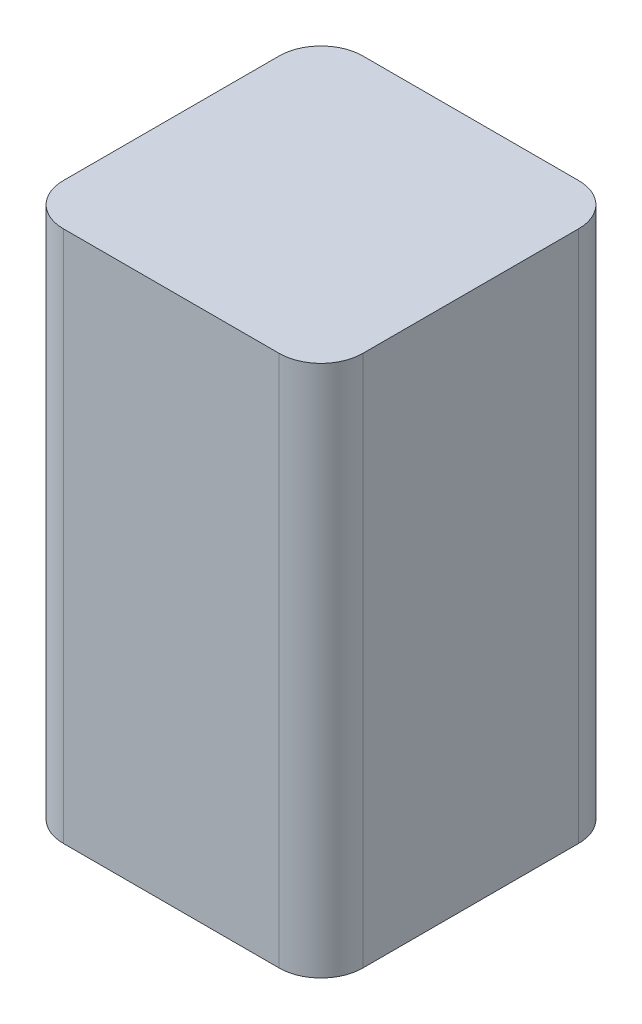
ISO-10303-21;
HEADER;
FILE_DESCRIPTION(('STEP AP214'),'2;1');
FILE_NAME('part.step','',(''),(''),'','','');
FILE_SCHEMA(('AUTOMOTIVE_DESIGN { 1 0 10303 214 1 1 1 1 }'));
ENDSEC;
DATA;
#1=APPLICATION_CONTEXT('core data for automotive mechanical design processes');
#2=APPLICATION_PROTOCOL_DEFINITION('international standard','automotive_design',2000,#1);
#3=PRODUCT_CONTEXT('',#1,'mechanical');
#4=PRODUCT('Part','Part','',(#3));
#5=PRODUCT_RELATED_PRODUCT_CATEGORY('part','',(#4));
#6=PRODUCT_DEFINITION_FORMATION('','',#4);
#7=PRODUCT_DEFINITION_CONTEXT('part definition',#1,'design');
#8=PRODUCT_DEFINITION('design','',#6,#7);
#9=PRODUCT_DEFINITION_SHAPE('','',#8);
#10=(LENGTH_UNIT() NAMED_UNIT(*) SI_UNIT(.MILLI.,.METRE.));
#11=(NAMED_UNIT(*) PLANE_ANGLE_UNIT() SI_UNIT($,.RADIAN.));
#12=(NAMED_UNIT(*) SI_UNIT($,.STERADIAN.) SOLID_ANGLE_UNIT());
#13=UNCERTAINTY_MEASURE_WITH_UNIT(LENGTH_MEASURE(1.E-05),#10,'distance_accuracy_value','');
#14=(GEOMETRIC_REPRESENTATION_CONTEXT(3) GLOBAL_UNCERTAINTY_ASSIGNED_CONTEXT((#13)) GLOBAL_UNIT_ASSIGNED_CONTEXT((#10,
#11,#12)) REPRESENTATION_CONTEXT('',''));
#15=CARTESIAN_POINT('',(0.,0.,0.));
#16=DIRECTION('',(0.,0.,1.));
#17=DIRECTION('',(1.,0.,0.));
#18=AXIS2_PLACEMENT_3D('',#15,#16,#17);
#19=CARTESIAN_POINT('',(5.,8.89,-5.));
#20=DIRECTION('',(0.,0.,1.));
#21=DIRECTION('',(1.,0.,0.));
#22=AXIS2_PLACEMENT_3D('',#19,#20,#21);
#23=PLANE('',#22);
#24=DIRECTION('',(-1.,0.,0.));
#25=VECTOR('',#24,1.);
#26=CARTESIAN_POINT('',(5.,-8.89,-5.));
#27=LINE('',#26,#25);
#28=CARTESIAN_POINT('',(3.603,-8.89,-5.));
#29=VERTEX_POINT('',#28);
#30=CARTESIAN_POINT('',(-3.603,-8.89,-5.));
#31=VERTEX_POINT('',#30);
#32=EDGE_CURVE('E130',#29,#31,#27,.T.);
#33=ORIENTED_EDGE('',*,*,#32,.T.);
#34=DIRECTION('',(0.,-1.,0.));
#35=VECTOR('',#34,1.);
#36=CARTESIAN_POINT('',(-3.603,8.89,-5.));
#37=LINE('',#36,#35);
#38=CARTESIAN_POINT('',(-3.603,8.89,-5.));
#39=VERTEX_POINT('',#38);
#40=EDGE_CURVE('E108',#31,#39,#37,.F.);
#41=ORIENTED_EDGE('',*,*,#40,.T.);
#42=DIRECTION('',(-1.,0.,0.));
#43=VECTOR('',#42,1.);
#44=CARTESIAN_POINT('',(5.,8.89,-5.));
#45=LINE('',#44,#43);
#46=CARTESIAN_POINT('',(3.603,8.89,-5.));
#47=VERTEX_POINT('',#46);
#48=EDGE_CURVE('E140',#47,#39,#45,.T.);
#49=ORIENTED_EDGE('',*,*,#48,.F.);
#50=DIRECTION('',(0.,-1.,0.));
#51=VECTOR('',#50,1.);
#52=CARTESIAN_POINT('',(3.603,8.89,-5.));
#53=LINE('',#52,#51);
#54=EDGE_CURVE('E113',#47,#29,#53,.T.);
#55=ORIENTED_EDGE('',*,*,#54,.T.);
#56=EDGE_LOOP('',(#33,#41,#49,#55));
#57=FACE_BOUND('',#56,.T.);
#58=ADVANCED_FACE('F37',(#57),#23,.F.);
#59=CARTESIAN_POINT('',(-5.,8.89,-5.));
#60=DIRECTION('',(1.,0.,0.));
#61=DIRECTION('',(0.,0.,-1.));
#62=AXIS2_PLACEMENT_3D('',#59,#60,#61);
#63=PLANE('',#62);
#64=DIRECTION('',(0.,0.,1.));
#65=VECTOR('',#64,1.);
#66=CARTESIAN_POINT('',(-5.,8.89,-5.));
#67=LINE('',#66,#65);
#68=CARTESIAN_POINT('',(-5.,8.89,-3.603));
#69=VERTEX_POINT('',#68);
#70=CARTESIAN_POINT('',(-5.,8.89,3.603));
#71=VERTEX_POINT('',#70);
#72=EDGE_CURVE('E123',#69,#71,#67,.T.);
#73=ORIENTED_EDGE('',*,*,#72,.F.);
#74=DIRECTION('',(0.,-1.,0.));
#75=VECTOR('',#74,1.);
#76=CARTESIAN_POINT('',(-5.,8.89,-3.603));
#77=LINE('',#76,#75);
#78=CARTESIAN_POINT('',(-5.,-8.89,-3.603));
#79=VERTEX_POINT('',#78);
#80=EDGE_CURVE('E107',#69,#79,#77,.T.);
#81=ORIENTED_EDGE('',*,*,#80,.T.);
#82=DIRECTION('',(0.,0.,1.));
#83=VECTOR('',#82,1.);
#84=CARTESIAN_POINT('',(-5.,-8.89,-5.));
#85=LINE('',#84,#83);
#86=CARTESIAN_POINT('',(-5.,-8.89,3.603));
#87=VERTEX_POINT('',#86);
#88=EDGE_CURVE('E120',#79,#87,#85,.T.);
#89=ORIENTED_EDGE('',*,*,#88,.T.);
#90=DIRECTION('',(0.,-1.,0.));
#91=VECTOR('',#90,1.);
#92=CARTESIAN_POINT('',(-5.,8.89,3.603));
#93=LINE('',#92,#91);
#94=EDGE_CURVE('E125',#87,#71,#93,.F.);
#95=ORIENTED_EDGE('',*,*,#94,.T.);
#96=EDGE_LOOP('',(#73,#81,#89,#95));
#97=FACE_BOUND('',#96,.T.);
#98=ADVANCED_FACE('F119',(#97),#63,.F.);
#99=CARTESIAN_POINT('',(-5.,8.89,5.));
#100=DIRECTION('',(0.,0.,-1.));
#101=DIRECTION('',(-1.,0.,0.));
#102=AXIS2_PLACEMENT_3D('',#99,#100,#101);
#103=PLANE('',#102);
#104=DIRECTION('',(1.,0.,0.));
#105=VECTOR('',#104,1.);
#106=CARTESIAN_POINT('',(-5.,-8.89,5.));
#107=LINE('',#106,#105);
#108=CARTESIAN_POINT('',(-3.603,-8.89,5.));
#109=VERTEX_POINT('',#108);
#110=CARTESIAN_POINT('',(3.603,-8.89,5.));
#111=VERTEX_POINT('',#110);
#112=EDGE_CURVE('E129',#109,#111,#107,.T.);
#113=ORIENTED_EDGE('',*,*,#112,.T.);
#114=DIRECTION('',(0.,-1.,0.));
#115=VECTOR('',#114,1.);
#116=CARTESIAN_POINT('',(3.603,8.89,5.));
#117=LINE('',#116,#115);
#118=CARTESIAN_POINT('',(3.603,8.89,5.));
#119=VERTEX_POINT('',#118);
#120=EDGE_CURVE('E11',#111,#119,#117,.F.);
#121=ORIENTED_EDGE('',*,*,#120,.T.);
#122=DIRECTION('',(1.,0.,0.));
#123=VECTOR('',#122,1.);
#124=CARTESIAN_POINT('',(-5.,8.89,5.));
#125=LINE('',#124,#123);
#126=CARTESIAN_POINT('',(-3.603,8.89,5.));
#127=VERTEX_POINT('',#126);
#128=EDGE_CURVE('E166',#127,#119,#125,.T.);
#129=ORIENTED_EDGE('',*,*,#128,.F.);
#130=DIRECTION('',(0.,-1.,0.));
#131=VECTOR('',#130,1.);
#132=CARTESIAN_POINT('',(-3.603,8.89,5.));
#133=LINE('',#132,#131);
#134=EDGE_CURVE('E45',#127,#109,#133,.T.);
#135=ORIENTED_EDGE('',*,*,#134,.T.);
#136=EDGE_LOOP('',(#113,#121,#129,#135));
#137=FACE_BOUND('',#136,.T.);
#138=ADVANCED_FACE('F164',(#137),#103,.F.);
#139=CARTESIAN_POINT('',(5.,8.89,5.));
#140=DIRECTION('',(-1.,0.,0.));
#141=DIRECTION('',(0.,0.,1.));
#142=AXIS2_PLACEMENT_3D('',#139,#140,#141);
#143=PLANE('',#142);
#144=DIRECTION('',(0.,0.,-1.));
#145=VECTOR('',#144,1.);
#146=CARTESIAN_POINT('',(5.,-8.89,5.));
#147=LINE('',#146,#145);
#148=CARTESIAN_POINT('',(5.,-8.89,3.603));
#149=VERTEX_POINT('',#148);
#150=CARTESIAN_POINT('',(5.,-8.89,-3.603));
#151=VERTEX_POINT('',#150);
#152=EDGE_CURVE('E133',#149,#151,#147,.T.);
#153=ORIENTED_EDGE('',*,*,#152,.T.);
#154=DIRECTION('',(0.,-1.,0.));
#155=VECTOR('',#154,1.);
#156=CARTESIAN_POINT('',(5.,8.89,-3.603));
#157=LINE('',#156,#155);
#158=CARTESIAN_POINT('',(5.,8.89,-3.603));
#159=VERTEX_POINT('',#158);
#160=EDGE_CURVE('E52',#151,#159,#157,.F.);
#161=ORIENTED_EDGE('',*,*,#160,.T.);
#162=DIRECTION('',(0.,0.,-1.));
#163=VECTOR('',#162,1.);
#164=CARTESIAN_POINT('',(5.,8.89,5.));
#165=LINE('',#164,#163);
#166=CARTESIAN_POINT('',(5.,8.89,3.603));
#167=VERTEX_POINT('',#166);
#168=EDGE_CURVE('E141',#167,#159,#165,.T.);
#169=ORIENTED_EDGE('',*,*,#168,.F.);
#170=DIRECTION('',(0.,-1.,0.));
#171=VECTOR('',#170,1.);
#172=CARTESIAN_POINT('',(5.,8.89,3.603));
#173=LINE('',#172,#171);
#174=EDGE_CURVE('E157',#167,#149,#173,.T.);
#175=ORIENTED_EDGE('',*,*,#174,.T.);
#176=EDGE_LOOP('',(#153,#161,#169,#175));
#177=FACE_BOUND('',#176,.T.);
#178=ADVANCED_FACE('F173',(#177),#143,.F.);
#179=CARTESIAN_POINT('',(0.,8.89,0.));
#180=DIRECTION('',(0.,1.,0.));
#181=DIRECTION('',(0.,0.,1.));
#182=AXIS2_PLACEMENT_3D('',#179,#180,#181);
#183=PLANE('',#182);
#184=ORIENTED_EDGE('',*,*,#48,.T.);
#185=CARTESIAN_POINT('',(-3.603,8.89,-3.603));
#186=DIRECTION('',(0.,1.,0.));
#187=DIRECTION('',(0.,0.,1.));
#188=AXIS2_PLACEMENT_3D('',#185,#186,#187);
#189=CIRCLE('',#188,1.397);
#190=EDGE_CURVE('E155',#39,#69,#189,.T.);
#191=ORIENTED_EDGE('',*,*,#190,.T.);
#192=ORIENTED_EDGE('',*,*,#72,.T.);
#193=CARTESIAN_POINT('',(-3.603,8.89,3.603));
#194=DIRECTION('',(0.,1.,0.));
#195=DIRECTION('',(0.,0.,1.));
#196=AXIS2_PLACEMENT_3D('',#193,#194,#195);
#197=CIRCLE('',#196,1.397);
#198=EDGE_CURVE('E150',#71,#127,#197,.T.);
#199=ORIENTED_EDGE('',*,*,#198,.T.);
#200=ORIENTED_EDGE('',*,*,#128,.T.);
#201=CARTESIAN_POINT('',(3.603,8.89,3.603));
#202=DIRECTION('',(0.,1.,0.));
#203=DIRECTION('',(0.,0.,1.));
#204=AXIS2_PLACEMENT_3D('',#201,#202,#203);
#205=CIRCLE('',#204,1.397);
#206=EDGE_CURVE('E59',#119,#167,#205,.T.);
#207=ORIENTED_EDGE('',*,*,#206,.T.);
#208=ORIENTED_EDGE('',*,*,#168,.T.);
#209=CARTESIAN_POINT('',(3.603,8.89,-3.603));
#210=DIRECTION('',(0.,1.,0.));
#211=DIRECTION('',(0.,0.,1.));
#212=AXIS2_PLACEMENT_3D('',#209,#210,#211);
#213=CIRCLE('',#212,1.397);
#214=EDGE_CURVE('E153',#159,#47,#213,.T.);
#215=ORIENTED_EDGE('',*,*,#214,.T.);
#216=EDGE_LOOP('',(#184,#191,#192,#199,#200,#207,#208,#215));
#217=FACE_BOUND('',#216,.T.);
#218=ADVANCED_FACE('F195',(#217),#183,.T.);
#219=CARTESIAN_POINT('',(0.,-8.89,0.));
#220=DIRECTION('',(0.,1.,0.));
#221=DIRECTION('',(0.,0.,1.));
#222=AXIS2_PLACEMENT_3D('',#219,#220,#221);
#223=PLANE('',#222);
#224=CARTESIAN_POINT('',(0.,-8.89,0.));
#225=DIRECTION('',(0.,-1.,0.));
#226=DIRECTION('',(0.,0.,-1.));
#227=AXIS2_PLACEMENT_3D('',#224,#225,#226);
#228=CIRCLE('',#227,2.5);
#229=CARTESIAN_POINT('',(0.,-8.89,-2.5));
#230=VERTEX_POINT('',#229);
#231=EDGE_CURVE('E180',#230,#230,#228,.T.);
#232=ORIENTED_EDGE('',*,*,#231,.F.);
#233=EDGE_LOOP('',(#232));
#234=FACE_BOUND('',#233,.T.);
#235=ORIENTED_EDGE('',*,*,#88,.F.);
#236=CARTESIAN_POINT('',(-3.603,-8.89,-3.603));
#237=DIRECTION('',(0.,1.,0.));
#238=DIRECTION('',(0.,0.,1.));
#239=AXIS2_PLACEMENT_3D('',#236,#237,#238);
#240=CIRCLE('',#239,1.397);
#241=EDGE_CURVE('E103',#79,#31,#240,.F.);
#242=ORIENTED_EDGE('',*,*,#241,.T.);
#243=ORIENTED_EDGE('',*,*,#32,.F.);
#244=CARTESIAN_POINT('',(3.603,-8.89,-3.603));
#245=DIRECTION('',(0.,1.,0.));
#246=DIRECTION('',(0.,0.,1.));
#247=AXIS2_PLACEMENT_3D('',#244,#245,#246);
#248=CIRCLE('',#247,1.397);
#249=EDGE_CURVE('E114',#29,#151,#248,.F.);
#250=ORIENTED_EDGE('',*,*,#249,.T.);
#251=ORIENTED_EDGE('',*,*,#152,.F.);
#252=CARTESIAN_POINT('',(3.603,-8.89,3.603));
#253=DIRECTION('',(0.,1.,0.));
#254=DIRECTION('',(0.,0.,1.));
#255=AXIS2_PLACEMENT_3D('',#252,#253,#254);
#256=CIRCLE('',#255,1.397);
#257=EDGE_CURVE('E144',#149,#111,#256,.F.);
#258=ORIENTED_EDGE('',*,*,#257,.T.);
#259=ORIENTED_EDGE('',*,*,#112,.F.);
#260=CARTESIAN_POINT('',(-3.603,-8.89,3.603));
#261=DIRECTION('',(0.,1.,0.));
#262=DIRECTION('',(0.,0.,1.));
#263=AXIS2_PLACEMENT_3D('',#260,#261,#262);
#264=CIRCLE('',#263,1.397);
#265=EDGE_CURVE('E124',#109,#87,#264,.F.);
#266=ORIENTED_EDGE('',*,*,#265,.T.);
#267=EDGE_LOOP('',(#235,#242,#243,#250,#251,#258,#259,#266));
#268=FACE_BOUND('',#267,.T.);
#269=ADVANCED_FACE('F127',(#234,#268),#223,.F.);
#270=CARTESIAN_POINT('',(0.,2.54,0.));
#271=DIRECTION('',(0.,-1.,0.));
#272=DIRECTION('',(0.,0.,-1.));
#273=AXIS2_PLACEMENT_3D('',#270,#271,#272);
#274=CYLINDRICAL_SURFACE('',#273,2.5);
#275=CARTESIAN_POINT('',(0.,2.54,0.));
#276=DIRECTION('',(0.,-1.,0.));
#277=DIRECTION('',(0.,0.,-1.));
#278=AXIS2_PLACEMENT_3D('',#275,#276,#277);
#279=CIRCLE('',#278,2.5);
#280=CARTESIAN_POINT('',(0.,2.54,-2.5));
#281=VERTEX_POINT('',#280);
#282=EDGE_CURVE('E135',#281,#281,#279,.T.);
#283=ORIENTED_EDGE('',*,*,#282,.F.);
#284=EDGE_LOOP('',(#283));
#285=FACE_BOUND('',#284,.T.);
#286=ORIENTED_EDGE('',*,*,#231,.T.);
#287=EDGE_LOOP('',(#286));
#288=FACE_BOUND('',#287,.T.);
#289=ADVANCED_FACE('F188',(#285,#288),#274,.F.);
#290=CARTESIAN_POINT('',(0.,2.54,0.));
#291=DIRECTION('',(0.,-1.,0.));
#292=DIRECTION('',(0.,0.,-1.));
#293=AXIS2_PLACEMENT_3D('',#290,#291,#292);
#294=PLANE('',#293);
#295=ORIENTED_EDGE('',*,*,#282,.T.);
#296=EDGE_LOOP('',(#295));
#297=FACE_BOUND('',#296,.T.);
#298=ADVANCED_FACE('F186',(#297),#294,.T.);
#299=CARTESIAN_POINT('',(-3.603,8.89,-3.603));
#300=DIRECTION('',(0.,-1.,0.));
#301=DIRECTION('',(0.,0.,-1.));
#302=AXIS2_PLACEMENT_3D('',#299,#300,#301);
#303=CYLINDRICAL_SURFACE('',#302,1.397);
#304=ORIENTED_EDGE('',*,*,#190,.F.);
#305=ORIENTED_EDGE('',*,*,#40,.F.);
#306=ORIENTED_EDGE('',*,*,#241,.F.);
#307=ORIENTED_EDGE('',*,*,#80,.F.);
#308=EDGE_LOOP('',(#304,#305,#306,#307));
#309=FACE_BOUND('',#308,.T.);
#310=ADVANCED_FACE('F106',(#309),#303,.T.);
#311=CARTESIAN_POINT('',(3.603,8.89,-3.603));
#312=DIRECTION('',(0.,-1.,0.));
#313=DIRECTION('',(0.,0.,-1.));
#314=AXIS2_PLACEMENT_3D('',#311,#312,#313);
#315=CYLINDRICAL_SURFACE('',#314,1.397);
#316=ORIENTED_EDGE('',*,*,#214,.F.);
#317=ORIENTED_EDGE('',*,*,#160,.F.);
#318=ORIENTED_EDGE('',*,*,#249,.F.);
#319=ORIENTED_EDGE('',*,*,#54,.F.);
#320=EDGE_LOOP('',(#316,#317,#318,#319));
#321=FACE_BOUND('',#320,.T.);
#322=ADVANCED_FACE('F213',(#321),#315,.T.);
#323=CARTESIAN_POINT('',(3.603,8.89,3.603));
#324=DIRECTION('',(0.,-1.,0.));
#325=DIRECTION('',(0.,0.,-1.));
#326=AXIS2_PLACEMENT_3D('',#323,#324,#325);
#327=CYLINDRICAL_SURFACE('',#326,1.397);
#328=ORIENTED_EDGE('',*,*,#206,.F.);
#329=ORIENTED_EDGE('',*,*,#120,.F.);
#330=ORIENTED_EDGE('',*,*,#257,.F.);
#331=ORIENTED_EDGE('',*,*,#174,.F.);
#332=EDGE_LOOP('',(#328,#329,#330,#331));
#333=FACE_BOUND('',#332,.T.);
#334=ADVANCED_FACE('F172',(#333),#327,.T.);
#335=CARTESIAN_POINT('',(-3.603,8.89,3.603));
#336=DIRECTION('',(0.,-1.,0.));
#337=DIRECTION('',(0.,0.,-1.));
#338=AXIS2_PLACEMENT_3D('',#335,#336,#337);
#339=CYLINDRICAL_SURFACE('',#338,1.397);
#340=ORIENTED_EDGE('',*,*,#198,.F.);
#341=ORIENTED_EDGE('',*,*,#94,.F.);
#342=ORIENTED_EDGE('',*,*,#265,.F.);
#343=ORIENTED_EDGE('',*,*,#134,.F.);
#344=EDGE_LOOP('',(#340,#341,#342,#343));
#345=FACE_BOUND('',#344,.T.);
#346=ADVANCED_FACE('F39',(#345),#339,.T.);
#347=CLOSED_SHELL('',(#58,#98,#138,#178,#218,#269,#289,#298,#310,#322,#334,#346));
#348=MANIFOLD_SOLID_BREP('B2',#347);
#349=ADVANCED_BREP_SHAPE_REPRESENTATION('',(#18,#348),#14);
#350=SHAPE_DEFINITION_REPRESENTATION(#9,#349);
ENDSEC;
END-ISO-10303-21;
